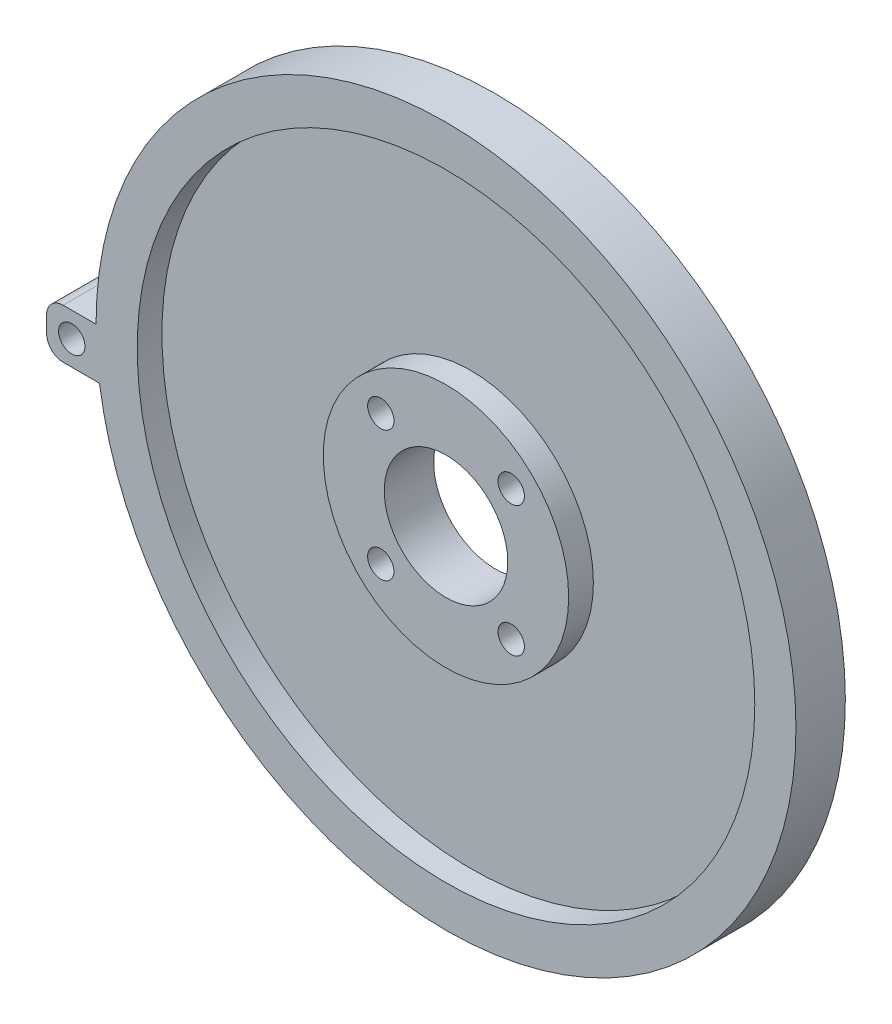
ISO-10303-21;
HEADER;
FILE_DESCRIPTION(('STEP AP214'),'2;1');
FILE_NAME('part.step','',(''),(''),'','','');
FILE_SCHEMA(('AUTOMOTIVE_DESIGN { 1 0 10303 214 1 1 1 1 }'));
ENDSEC;
DATA;
#1=APPLICATION_CONTEXT('core data for automotive mechanical design processes');
#2=APPLICATION_PROTOCOL_DEFINITION('international standard','automotive_design',2000,#1);
#3=PRODUCT_CONTEXT('',#1,'mechanical');
#4=PRODUCT('Part','Part','',(#3));
#5=PRODUCT_RELATED_PRODUCT_CATEGORY('part','',(#4));
#6=PRODUCT_DEFINITION_FORMATION('','',#4);
#7=PRODUCT_DEFINITION_CONTEXT('part definition',#1,'design');
#8=PRODUCT_DEFINITION('design','',#6,#7);
#9=PRODUCT_DEFINITION_SHAPE('','',#8);
#10=(LENGTH_UNIT() NAMED_UNIT(*) SI_UNIT(.MILLI.,.METRE.));
#11=(NAMED_UNIT(*) PLANE_ANGLE_UNIT() SI_UNIT($,.RADIAN.));
#12=(NAMED_UNIT(*) SI_UNIT($,.STERADIAN.) SOLID_ANGLE_UNIT());
#13=UNCERTAINTY_MEASURE_WITH_UNIT(LENGTH_MEASURE(1.E-05),#10,'distance_accuracy_value','');
#14=(GEOMETRIC_REPRESENTATION_CONTEXT(3) GLOBAL_UNCERTAINTY_ASSIGNED_CONTEXT((#13)) GLOBAL_UNIT_ASSIGNED_CONTEXT((#10,
#11,#12)) REPRESENTATION_CONTEXT('',''));
#15=CARTESIAN_POINT('',(0.,0.,0.));
#16=DIRECTION('',(0.,0.,1.));
#17=DIRECTION('',(1.,0.,0.));
#18=AXIS2_PLACEMENT_3D('',#15,#16,#17);
#19=CARTESIAN_POINT('',(260.117045421253,-9.10000000006363,3.));
#20=DIRECTION('',(0.,0.,-1.));
#21=DIRECTION('',(-1.,0.,0.));
#22=AXIS2_PLACEMENT_3D('',#19,#20,#21);
#23=CYLINDRICAL_SURFACE('',#22,42.4999999999999);
#24=DIRECTION('',(0.,0.,-1.));
#25=VECTOR('',#24,1.);
#26=CARTESIAN_POINT('',(217.617045421253,-9.10000000006364,14.7914230722365));
#27=LINE('',#26,#25);
#28=CARTESIAN_POINT('',(217.617045421253,-9.10000000006364,6.));
#29=VERTEX_POINT('',#28);
#30=CARTESIAN_POINT('',(217.617045421253,-9.10000000006364,0.));
#31=VERTEX_POINT('',#30);
#32=EDGE_CURVE('E119',#29,#31,#27,.T.);
#33=ORIENTED_EDGE('',*,*,#32,.F.);
#34=CARTESIAN_POINT('',(260.117045421253,-9.10000000006363,6.));
#35=DIRECTION('',(0.,0.,1.));
#36=DIRECTION('',(1.,0.,0.));
#37=AXIS2_PLACEMENT_3D('',#34,#35,#36);
#38=CIRCLE('',#37,42.4999999999999);
#39=CARTESIAN_POINT('',(218.042706448419,-15.0999999999819,6.));
#40=VERTEX_POINT('',#39);
#41=EDGE_CURVE('E117',#40,#29,#38,.T.);
#42=ORIENTED_EDGE('',*,*,#41,.F.);
#43=DIRECTION('',(0.,0.,-1.));
#44=VECTOR('',#43,1.);
#45=CARTESIAN_POINT('',(218.042706448419,-15.0999999999819,14.7914230722365));
#46=LINE('',#45,#44);
#47=CARTESIAN_POINT('',(218.042706448419,-15.0999999999819,0.));
#48=VERTEX_POINT('',#47);
#49=EDGE_CURVE('E102',#40,#48,#46,.T.);
#50=ORIENTED_EDGE('',*,*,#49,.T.);
#51=CARTESIAN_POINT('',(260.117045421253,-9.10000000006363,0.));
#52=DIRECTION('',(0.,0.,1.));
#53=DIRECTION('',(1.,0.,0.));
#54=AXIS2_PLACEMENT_3D('',#51,#52,#53);
#55=CIRCLE('',#54,42.4999999999999);
#56=EDGE_CURVE('E54',#48,#31,#55,.T.);
#57=ORIENTED_EDGE('',*,*,#56,.T.);
#58=EDGE_LOOP('',(#33,#42,#50,#57));
#59=FACE_BOUND('',#58,.T.);
#60=ADVANCED_FACE('F46',(#59),#23,.T.);
#61=CARTESIAN_POINT('',(260.117045421253,-9.10000000006363,3.));
#62=DIRECTION('',(0.,0.,1.));
#63=DIRECTION('',(1.,0.,0.));
#64=AXIS2_PLACEMENT_3D('',#61,#62,#63);
#65=PLANE('',#64);
#66=CARTESIAN_POINT('',(260.117045421253,-9.10000000006363,3.));
#67=DIRECTION('',(0.,0.,1.));
#68=DIRECTION('',(1.,0.,0.));
#69=AXIS2_PLACEMENT_3D('',#66,#67,#68);
#70=CIRCLE('',#69,14.9);
#71=CARTESIAN_POINT('',(275.017045421253,-9.10000000006363,3.));
#72=VERTEX_POINT('',#71);
#73=EDGE_CURVE('E157',#72,#72,#70,.T.);
#74=ORIENTED_EDGE('',*,*,#73,.F.);
#75=EDGE_LOOP('',(#74));
#76=FACE_BOUND('',#75,.T.);
#77=CARTESIAN_POINT('',(260.117045421253,-9.10000000006363,3.));
#78=DIRECTION('',(0.,0.,1.));
#79=DIRECTION('',(1.,0.,0.));
#80=AXIS2_PLACEMENT_3D('',#77,#78,#79);
#81=CIRCLE('',#80,37.4999999999999);
#82=CARTESIAN_POINT('',(297.617045421253,-9.10000000006363,3.));
#83=VERTEX_POINT('',#82);
#84=EDGE_CURVE('E12',#83,#83,#81,.F.);
#85=ORIENTED_EDGE('',*,*,#84,.F.);
#86=EDGE_LOOP('',(#85));
#87=FACE_BOUND('',#86,.T.);
#88=ADVANCED_FACE('F281',(#76,#87),#65,.T.);
#89=CARTESIAN_POINT('',(260.117045421253,-9.10000000006363,0.));
#90=DIRECTION('',(0.,0.,1.));
#91=DIRECTION('',(1.,0.,0.));
#92=AXIS2_PLACEMENT_3D('',#89,#90,#91);
#93=PLANE('',#92);
#94=ORIENTED_EDGE('',*,*,#56,.F.);
#95=DIRECTION('',(-1.,0.,0.));
#96=VECTOR('',#95,1.);
#97=CARTESIAN_POINT('',(213.617045421253,-15.0999999999819,0.));
#98=LINE('',#97,#96);
#99=CARTESIAN_POINT('',(213.617045421253,-15.0999999999819,0.));
#100=VERTEX_POINT('',#99);
#101=EDGE_CURVE('E99',#48,#100,#98,.T.);
#102=ORIENTED_EDGE('',*,*,#101,.T.);
#103=CARTESIAN_POINT('',(213.617045421253,-13.0999999999819,0.));
#104=DIRECTION('',(0.,0.,1.));
#105=DIRECTION('',(1.,0.,0.));
#106=AXIS2_PLACEMENT_3D('',#103,#104,#105);
#107=CIRCLE('',#106,2.);
#108=CARTESIAN_POINT('',(211.617045421253,-13.0999999999819,0.));
#109=VERTEX_POINT('',#108);
#110=EDGE_CURVE('E112',#100,#109,#107,.F.);
#111=ORIENTED_EDGE('',*,*,#110,.T.);
#112=DIRECTION('',(0.,1.,0.));
#113=VECTOR('',#112,1.);
#114=CARTESIAN_POINT('',(211.617045421253,-11.1000000000636,0.));
#115=LINE('',#114,#113);
#116=CARTESIAN_POINT('',(211.617045421253,-11.1000000000636,0.));
#117=VERTEX_POINT('',#116);
#118=EDGE_CURVE('E222',#109,#117,#115,.T.);
#119=ORIENTED_EDGE('',*,*,#118,.T.);
#120=CARTESIAN_POINT('',(213.617045421253,-11.1000000000636,0.));
#121=DIRECTION('',(0.,0.,1.));
#122=DIRECTION('',(1.,0.,0.));
#123=AXIS2_PLACEMENT_3D('',#120,#121,#122);
#124=CIRCLE('',#123,2.);
#125=CARTESIAN_POINT('',(213.617045421253,-9.10000000006364,0.));
#126=VERTEX_POINT('',#125);
#127=EDGE_CURVE('E226',#117,#126,#124,.F.);
#128=ORIENTED_EDGE('',*,*,#127,.T.);
#129=DIRECTION('',(1.,0.,0.));
#130=VECTOR('',#129,1.);
#131=CARTESIAN_POINT('',(217.617045421253,-9.10000000006364,0.));
#132=LINE('',#131,#130);
#133=EDGE_CURVE('E126',#126,#31,#132,.T.);
#134=ORIENTED_EDGE('',*,*,#133,.T.);
#135=EDGE_LOOP('',(#94,#102,#111,#119,#128,#134));
#136=FACE_BOUND('',#135,.T.);
#137=CARTESIAN_POINT('',(260.117045421253,-9.10000000006363,0.));
#138=DIRECTION('',(0.,0.,1.));
#139=DIRECTION('',(1.,0.,0.));
#140=AXIS2_PLACEMENT_3D('',#137,#138,#139);
#141=CIRCLE('',#140,7.49999999999995);
#142=CARTESIAN_POINT('',(267.617045421253,-9.10000000006363,0.));
#143=VERTEX_POINT('',#142);
#144=EDGE_CURVE('E128',#143,#143,#141,.T.);
#145=ORIENTED_EDGE('',*,*,#144,.T.);
#146=EDGE_LOOP('',(#145));
#147=FACE_BOUND('',#146,.T.);
#148=CARTESIAN_POINT('',(252.19744947196,-1.18040405078631,0.));
#149=DIRECTION('',(0.,0.,1.));
#150=DIRECTION('',(1.,0.,0.));
#151=AXIS2_PLACEMENT_3D('',#148,#149,#150);
#152=CIRCLE('',#151,1.59999999999404);
#153=CARTESIAN_POINT('',(253.797449471954,-1.18040405078631,0.));
#154=VERTEX_POINT('',#153);
#155=EDGE_CURVE('E132',#154,#154,#152,.T.);
#156=ORIENTED_EDGE('',*,*,#155,.T.);
#157=EDGE_LOOP('',(#156));
#158=FACE_BOUND('',#157,.T.);
#159=CARTESIAN_POINT('',(268.03664137053,-1.18040405077101,0.));
#160=DIRECTION('',(0.,0.,1.));
#161=DIRECTION('',(1.,0.,0.));
#162=AXIS2_PLACEMENT_3D('',#159,#160,#161);
#163=CIRCLE('',#162,1.59999999999404);
#164=CARTESIAN_POINT('',(269.636641370524,-1.18040405077101,0.));
#165=VERTEX_POINT('',#164);
#166=EDGE_CURVE('E138',#165,#165,#163,.T.);
#167=ORIENTED_EDGE('',*,*,#166,.T.);
#168=EDGE_LOOP('',(#167));
#169=FACE_BOUND('',#168,.T.);
#170=CARTESIAN_POINT('',(252.197449471976,-17.0195959493562,0.));
#171=DIRECTION('',(0.,0.,1.));
#172=DIRECTION('',(1.,0.,0.));
#173=AXIS2_PLACEMENT_3D('',#170,#171,#172);
#174=CIRCLE('',#173,1.59999999999427);
#175=CARTESIAN_POINT('',(253.79744947197,-17.0195959493562,0.));
#176=VERTEX_POINT('',#175);
#177=EDGE_CURVE('E142',#176,#176,#174,.T.);
#178=ORIENTED_EDGE('',*,*,#177,.T.);
#179=EDGE_LOOP('',(#178));
#180=FACE_BOUND('',#179,.T.);
#181=CARTESIAN_POINT('',(268.036641370546,-17.019595949341,0.));
#182=DIRECTION('',(0.,0.,1.));
#183=DIRECTION('',(1.,0.,0.));
#184=AXIS2_PLACEMENT_3D('',#181,#182,#183);
#185=CIRCLE('',#184,1.59999999999404);
#186=CARTESIAN_POINT('',(269.63664137054,-17.019595949341,0.));
#187=VERTEX_POINT('',#186);
#188=EDGE_CURVE('E146',#187,#187,#185,.T.);
#189=ORIENTED_EDGE('',*,*,#188,.T.);
#190=EDGE_LOOP('',(#189));
#191=FACE_BOUND('',#190,.T.);
#192=CARTESIAN_POINT('',(214.670319829944,-12.1037699979797,0.));
#193=DIRECTION('',(0.,0.,1.));
#194=DIRECTION('',(1.,0.,0.));
#195=AXIS2_PLACEMENT_3D('',#192,#193,#194);
#196=CIRCLE('',#195,1.59999999999999);
#197=CARTESIAN_POINT('',(216.270319829944,-12.1037699979797,0.));
#198=VERTEX_POINT('',#197);
#199=EDGE_CURVE('E111',#198,#198,#196,.F.);
#200=ORIENTED_EDGE('',*,*,#199,.F.);
#201=EDGE_LOOP('',(#200));
#202=FACE_BOUND('',#201,.T.);
#203=ADVANCED_FACE('F122',(#136,#147,#158,#169,#180,#191,#202),#93,.F.);
#204=CARTESIAN_POINT('',(260.117045421253,-9.10000000006363,3.));
#205=DIRECTION('',(0.,0.,-1.));
#206=DIRECTION('',(-1.,0.,0.));
#207=AXIS2_PLACEMENT_3D('',#204,#205,#206);
#208=CYLINDRICAL_SURFACE('',#207,7.49999999999995);
#209=ORIENTED_EDGE('',*,*,#144,.F.);
#210=EDGE_LOOP('',(#209));
#211=FACE_BOUND('',#210,.T.);
#212=CARTESIAN_POINT('',(260.117045421253,-9.10000000006363,6.));
#213=DIRECTION('',(0.,0.,1.));
#214=DIRECTION('',(1.,0.,0.));
#215=AXIS2_PLACEMENT_3D('',#212,#213,#214);
#216=CIRCLE('',#215,7.49999999999995);
#217=CARTESIAN_POINT('',(267.617045421253,-9.10000000006363,6.));
#218=VERTEX_POINT('',#217);
#219=EDGE_CURVE('E169',#218,#218,#216,.F.);
#220=ORIENTED_EDGE('',*,*,#219,.F.);
#221=EDGE_LOOP('',(#220));
#222=FACE_BOUND('',#221,.T.);
#223=ADVANCED_FACE('F290',(#211,#222),#208,.F.);
#224=CARTESIAN_POINT('',(252.19744947196,-1.18040405078631,3.));
#225=DIRECTION('',(0.,0.,-1.));
#226=DIRECTION('',(-1.,0.,0.));
#227=AXIS2_PLACEMENT_3D('',#224,#225,#226);
#228=CYLINDRICAL_SURFACE('',#227,1.59999999999404);
#229=ORIENTED_EDGE('',*,*,#155,.F.);
#230=EDGE_LOOP('',(#229));
#231=FACE_BOUND('',#230,.T.);
#232=CARTESIAN_POINT('',(252.19744947196,-1.18040405078631,6.));
#233=DIRECTION('',(0.,0.,1.));
#234=DIRECTION('',(1.,0.,0.));
#235=AXIS2_PLACEMENT_3D('',#232,#233,#234);
#236=CIRCLE('',#235,1.59999999999404);
#237=CARTESIAN_POINT('',(253.797449471954,-1.18040405078631,6.));
#238=VERTEX_POINT('',#237);
#239=EDGE_CURVE('E165',#238,#238,#236,.F.);
#240=ORIENTED_EDGE('',*,*,#239,.F.);
#241=EDGE_LOOP('',(#240));
#242=FACE_BOUND('',#241,.T.);
#243=ADVANCED_FACE('F296',(#231,#242),#228,.F.);
#244=CARTESIAN_POINT('',(268.03664137053,-1.18040405077101,3.));
#245=DIRECTION('',(0.,0.,-1.));
#246=DIRECTION('',(-1.,0.,0.));
#247=AXIS2_PLACEMENT_3D('',#244,#245,#246);
#248=CYLINDRICAL_SURFACE('',#247,1.59999999999404);
#249=ORIENTED_EDGE('',*,*,#166,.F.);
#250=EDGE_LOOP('',(#249));
#251=FACE_BOUND('',#250,.T.);
#252=CARTESIAN_POINT('',(268.03664137053,-1.18040405077101,6.));
#253=DIRECTION('',(0.,0.,1.));
#254=DIRECTION('',(1.,0.,0.));
#255=AXIS2_PLACEMENT_3D('',#252,#253,#254);
#256=CIRCLE('',#255,1.59999999999404);
#257=CARTESIAN_POINT('',(269.636641370524,-1.18040405077101,6.));
#258=VERTEX_POINT('',#257);
#259=EDGE_CURVE('E177',#258,#258,#256,.F.);
#260=ORIENTED_EDGE('',*,*,#259,.F.);
#261=EDGE_LOOP('',(#260));
#262=FACE_BOUND('',#261,.T.);
#263=ADVANCED_FACE('F300',(#251,#262),#248,.F.);
#264=CARTESIAN_POINT('',(252.197449471976,-17.0195959493562,3.));
#265=DIRECTION('',(0.,0.,-1.));
#266=DIRECTION('',(-1.,0.,0.));
#267=AXIS2_PLACEMENT_3D('',#264,#265,#266);
#268=CYLINDRICAL_SURFACE('',#267,1.59999999999427);
#269=ORIENTED_EDGE('',*,*,#177,.F.);
#270=EDGE_LOOP('',(#269));
#271=FACE_BOUND('',#270,.T.);
#272=CARTESIAN_POINT('',(252.197449471976,-17.0195959493562,6.));
#273=DIRECTION('',(0.,0.,1.));
#274=DIRECTION('',(1.,0.,0.));
#275=AXIS2_PLACEMENT_3D('',#272,#273,#274);
#276=CIRCLE('',#275,1.59999999999427);
#277=CARTESIAN_POINT('',(253.79744947197,-17.0195959493562,6.));
#278=VERTEX_POINT('',#277);
#279=EDGE_CURVE('E161',#278,#278,#276,.F.);
#280=ORIENTED_EDGE('',*,*,#279,.F.);
#281=EDGE_LOOP('',(#280));
#282=FACE_BOUND('',#281,.T.);
#283=ADVANCED_FACE('F304',(#271,#282),#268,.F.);
#284=CARTESIAN_POINT('',(268.036641370546,-17.019595949341,3.));
#285=DIRECTION('',(0.,0.,-1.));
#286=DIRECTION('',(-1.,0.,0.));
#287=AXIS2_PLACEMENT_3D('',#284,#285,#286);
#288=CYLINDRICAL_SURFACE('',#287,1.59999999999404);
#289=ORIENTED_EDGE('',*,*,#188,.F.);
#290=EDGE_LOOP('',(#289));
#291=FACE_BOUND('',#290,.T.);
#292=CARTESIAN_POINT('',(268.036641370546,-17.019595949341,6.));
#293=DIRECTION('',(0.,0.,1.));
#294=DIRECTION('',(1.,0.,0.));
#295=AXIS2_PLACEMENT_3D('',#292,#293,#294);
#296=CIRCLE('',#295,1.59999999999404);
#297=CARTESIAN_POINT('',(269.63664137054,-17.019595949341,6.));
#298=VERTEX_POINT('',#297);
#299=EDGE_CURVE('E173',#298,#298,#296,.F.);
#300=ORIENTED_EDGE('',*,*,#299,.F.);
#301=EDGE_LOOP('',(#300));
#302=FACE_BOUND('',#301,.T.);
#303=ADVANCED_FACE('F308',(#291,#302),#288,.F.);
#304=CARTESIAN_POINT('',(260.117045421253,-9.10000000006363,6.));
#305=DIRECTION('',(0.,0.,-1.));
#306=DIRECTION('',(-1.,0.,0.));
#307=AXIS2_PLACEMENT_3D('',#304,#305,#306);
#308=CYLINDRICAL_SURFACE('',#307,37.4999999999999);
#309=CARTESIAN_POINT('',(260.117045421253,-9.10000000006363,6.));
#310=DIRECTION('',(0.,0.,1.));
#311=DIRECTION('',(1.,0.,0.));
#312=AXIS2_PLACEMENT_3D('',#309,#310,#311);
#313=CIRCLE('',#312,37.4999999999999);
#314=CARTESIAN_POINT('',(297.617045421253,-9.10000000006363,6.));
#315=VERTEX_POINT('',#314);
#316=EDGE_CURVE('E152',#315,#315,#313,.T.);
#317=ORIENTED_EDGE('',*,*,#316,.T.);
#318=EDGE_LOOP('',(#317));
#319=FACE_BOUND('',#318,.T.);
#320=ORIENTED_EDGE('',*,*,#84,.T.);
#321=EDGE_LOOP('',(#320));
#322=FACE_BOUND('',#321,.T.);
#323=ADVANCED_FACE('F312',(#319,#322),#308,.F.);
#324=CARTESIAN_POINT('',(0.,0.,6.));
#325=DIRECTION('',(0.,0.,1.));
#326=DIRECTION('',(1.,0.,0.));
#327=AXIS2_PLACEMENT_3D('',#324,#325,#326);
#328=PLANE('',#327);
#329=ORIENTED_EDGE('',*,*,#316,.F.);
#330=EDGE_LOOP('',(#329));
#331=FACE_BOUND('',#330,.T.);
#332=ORIENTED_EDGE('',*,*,#41,.T.);
#333=DIRECTION('',(-1.,0.,0.));
#334=VECTOR('',#333,1.);
#335=CARTESIAN_POINT('',(217.617045421253,-9.10000000006364,6.));
#336=LINE('',#335,#334);
#337=CARTESIAN_POINT('',(213.617045421253,-9.10000000006364,6.));
#338=VERTEX_POINT('',#337);
#339=EDGE_CURVE('E206',#29,#338,#336,.T.);
#340=ORIENTED_EDGE('',*,*,#339,.T.);
#341=CARTESIAN_POINT('',(213.617045421253,-11.1000000000636,6.));
#342=DIRECTION('',(0.,0.,1.));
#343=DIRECTION('',(1.,0.,0.));
#344=AXIS2_PLACEMENT_3D('',#341,#342,#343);
#345=CIRCLE('',#344,2.);
#346=CARTESIAN_POINT('',(211.617045421253,-11.1000000000636,6.));
#347=VERTEX_POINT('',#346);
#348=EDGE_CURVE('E210',#338,#347,#345,.T.);
#349=ORIENTED_EDGE('',*,*,#348,.T.);
#350=DIRECTION('',(0.,-1.,0.));
#351=VECTOR('',#350,1.);
#352=CARTESIAN_POINT('',(211.617045421253,-11.1000000000636,6.));
#353=LINE('',#352,#351);
#354=CARTESIAN_POINT('',(211.617045421253,-13.0999999999819,6.));
#355=VERTEX_POINT('',#354);
#356=EDGE_CURVE('E188',#347,#355,#353,.T.);
#357=ORIENTED_EDGE('',*,*,#356,.T.);
#358=CARTESIAN_POINT('',(213.617045421253,-13.0999999999819,6.));
#359=DIRECTION('',(0.,0.,1.));
#360=DIRECTION('',(1.,0.,0.));
#361=AXIS2_PLACEMENT_3D('',#358,#359,#360);
#362=CIRCLE('',#361,2.);
#363=CARTESIAN_POINT('',(213.617045421253,-15.0999999999819,6.));
#364=VERTEX_POINT('',#363);
#365=EDGE_CURVE('E201',#355,#364,#362,.T.);
#366=ORIENTED_EDGE('',*,*,#365,.T.);
#367=DIRECTION('',(1.,0.,0.));
#368=VECTOR('',#367,1.);
#369=CARTESIAN_POINT('',(213.617045421253,-15.0999999999819,6.));
#370=LINE('',#369,#368);
#371=EDGE_CURVE('E61',#364,#40,#370,.T.);
#372=ORIENTED_EDGE('',*,*,#371,.T.);
#373=EDGE_LOOP('',(#332,#340,#349,#357,#366,#372));
#374=FACE_BOUND('',#373,.T.);
#375=CARTESIAN_POINT('',(214.670319829944,-12.1037699979797,6.));
#376=DIRECTION('',(0.,0.,1.));
#377=DIRECTION('',(1.,0.,0.));
#378=AXIS2_PLACEMENT_3D('',#375,#376,#377);
#379=CIRCLE('',#378,1.59999999999999);
#380=CARTESIAN_POINT('',(216.270319829944,-12.1037699979797,6.));
#381=VERTEX_POINT('',#380);
#382=EDGE_CURVE('E184',#381,#381,#379,.T.);
#383=ORIENTED_EDGE('',*,*,#382,.F.);
#384=EDGE_LOOP('',(#383));
#385=FACE_BOUND('',#384,.T.);
#386=ADVANCED_FACE('F266',(#331,#374,#385),#328,.T.);
#387=CARTESIAN_POINT('',(260.117045421253,-9.10000000006363,6.));
#388=DIRECTION('',(0.,0.,-1.));
#389=DIRECTION('',(-1.,0.,0.));
#390=AXIS2_PLACEMENT_3D('',#387,#388,#389);
#391=CYLINDRICAL_SURFACE('',#390,14.9);
#392=CARTESIAN_POINT('',(260.117045421253,-9.10000000006363,6.));
#393=DIRECTION('',(0.,0.,1.));
#394=DIRECTION('',(1.,0.,0.));
#395=AXIS2_PLACEMENT_3D('',#392,#393,#394);
#396=CIRCLE('',#395,14.9);
#397=CARTESIAN_POINT('',(275.017045421253,-9.10000000006363,6.));
#398=VERTEX_POINT('',#397);
#399=EDGE_CURVE('E156',#398,#398,#396,.T.);
#400=ORIENTED_EDGE('',*,*,#399,.F.);
#401=EDGE_LOOP('',(#400));
#402=FACE_BOUND('',#401,.T.);
#403=ORIENTED_EDGE('',*,*,#73,.T.);
#404=EDGE_LOOP('',(#403));
#405=FACE_BOUND('',#404,.T.);
#406=ADVANCED_FACE('F319',(#402,#405),#391,.T.);
#407=CARTESIAN_POINT('',(0.,0.,6.));
#408=DIRECTION('',(0.,0.,1.));
#409=DIRECTION('',(1.,0.,0.));
#410=AXIS2_PLACEMENT_3D('',#407,#408,#409);
#411=PLANE('',#410);
#412=ORIENTED_EDGE('',*,*,#279,.T.);
#413=EDGE_LOOP('',(#412));
#414=FACE_BOUND('',#413,.T.);
#415=ORIENTED_EDGE('',*,*,#259,.T.);
#416=EDGE_LOOP('',(#415));
#417=FACE_BOUND('',#416,.T.);
#418=ORIENTED_EDGE('',*,*,#299,.T.);
#419=EDGE_LOOP('',(#418));
#420=FACE_BOUND('',#419,.T.);
#421=ORIENTED_EDGE('',*,*,#219,.T.);
#422=EDGE_LOOP('',(#421));
#423=FACE_BOUND('',#422,.T.);
#424=ORIENTED_EDGE('',*,*,#239,.T.);
#425=EDGE_LOOP('',(#424));
#426=FACE_BOUND('',#425,.T.);
#427=ORIENTED_EDGE('',*,*,#399,.T.);
#428=EDGE_LOOP('',(#427));
#429=FACE_BOUND('',#428,.T.);
#430=ADVANCED_FACE('F277',(#414,#417,#420,#423,#426,#429),#411,.T.);
#431=CARTESIAN_POINT('',(211.617045421253,-11.1000000000636,14.7914230722365));
#432=DIRECTION('',(1.,0.,0.));
#433=DIRECTION('',(0.,0.,-1.));
#434=AXIS2_PLACEMENT_3D('',#431,#432,#433);
#435=PLANE('',#434);
#436=ORIENTED_EDGE('',*,*,#356,.F.);
#437=DIRECTION('',(0.,0.,-1.));
#438=VECTOR('',#437,1.);
#439=CARTESIAN_POINT('',(211.617045421253,-11.1000000000636,14.7914230722365));
#440=LINE('',#439,#438);
#441=EDGE_CURVE('E69',#347,#117,#440,.T.);
#442=ORIENTED_EDGE('',*,*,#441,.T.);
#443=ORIENTED_EDGE('',*,*,#118,.F.);
#444=DIRECTION('',(0.,0.,-1.));
#445=VECTOR('',#444,1.);
#446=CARTESIAN_POINT('',(211.617045421253,-13.0999999999819,14.7914230722365));
#447=LINE('',#446,#445);
#448=EDGE_CURVE('E198',#355,#109,#447,.T.);
#449=ORIENTED_EDGE('',*,*,#448,.F.);
#450=EDGE_LOOP('',(#436,#442,#443,#449));
#451=FACE_BOUND('',#450,.T.);
#452=ADVANCED_FACE('F270',(#451),#435,.F.);
#453=CARTESIAN_POINT('',(213.617045421253,-11.1000000000636,14.7914230722365));
#454=DIRECTION('',(0.,0.,-1.));
#455=DIRECTION('',(-1.,0.,0.));
#456=AXIS2_PLACEMENT_3D('',#453,#454,#455);
#457=CYLINDRICAL_SURFACE('',#456,2.);
#458=ORIENTED_EDGE('',*,*,#348,.F.);
#459=DIRECTION('',(0.,0.,-1.));
#460=VECTOR('',#459,1.);
#461=CARTESIAN_POINT('',(213.617045421253,-9.10000000006364,14.7914230722365));
#462=LINE('',#461,#460);
#463=EDGE_CURVE('E193',#338,#126,#462,.T.);
#464=ORIENTED_EDGE('',*,*,#463,.T.);
#465=ORIENTED_EDGE('',*,*,#127,.F.);
#466=ORIENTED_EDGE('',*,*,#441,.F.);
#467=EDGE_LOOP('',(#458,#464,#465,#466));
#468=FACE_BOUND('',#467,.T.);
#469=ADVANCED_FACE('F268',(#468),#457,.T.);
#470=CARTESIAN_POINT('',(217.617045421253,-9.10000000006364,14.7914230722365));
#471=DIRECTION('',(0.,-1.,0.));
#472=DIRECTION('',(0.,0.,-1.));
#473=AXIS2_PLACEMENT_3D('',#470,#471,#472);
#474=PLANE('',#473);
#475=ORIENTED_EDGE('',*,*,#339,.F.);
#476=ORIENTED_EDGE('',*,*,#32,.T.);
#477=ORIENTED_EDGE('',*,*,#133,.F.);
#478=ORIENTED_EDGE('',*,*,#463,.F.);
#479=EDGE_LOOP('',(#475,#476,#477,#478));
#480=FACE_BOUND('',#479,.T.);
#481=ADVANCED_FACE('F265',(#480),#474,.F.);
#482=CARTESIAN_POINT('',(213.617045421253,-15.0999999999819,14.7914230722365));
#483=DIRECTION('',(0.,1.,0.));
#484=DIRECTION('',(0.,0.,1.));
#485=AXIS2_PLACEMENT_3D('',#482,#483,#484);
#486=PLANE('',#485);
#487=ORIENTED_EDGE('',*,*,#371,.F.);
#488=DIRECTION('',(0.,0.,-1.));
#489=VECTOR('',#488,1.);
#490=CARTESIAN_POINT('',(213.617045421253,-15.0999999999819,14.7914230722365));
#491=LINE('',#490,#489);
#492=EDGE_CURVE('E105',#364,#100,#491,.T.);
#493=ORIENTED_EDGE('',*,*,#492,.T.);
#494=ORIENTED_EDGE('',*,*,#101,.F.);
#495=ORIENTED_EDGE('',*,*,#49,.F.);
#496=EDGE_LOOP('',(#487,#493,#494,#495));
#497=FACE_BOUND('',#496,.T.);
#498=ADVANCED_FACE('F101',(#497),#486,.F.);
#499=CARTESIAN_POINT('',(213.617045421253,-13.0999999999819,14.7914230722365));
#500=DIRECTION('',(0.,0.,-1.));
#501=DIRECTION('',(-1.,0.,0.));
#502=AXIS2_PLACEMENT_3D('',#499,#500,#501);
#503=CYLINDRICAL_SURFACE('',#502,2.);
#504=ORIENTED_EDGE('',*,*,#365,.F.);
#505=ORIENTED_EDGE('',*,*,#448,.T.);
#506=ORIENTED_EDGE('',*,*,#110,.F.);
#507=ORIENTED_EDGE('',*,*,#492,.F.);
#508=EDGE_LOOP('',(#504,#505,#506,#507));
#509=FACE_BOUND('',#508,.T.);
#510=ADVANCED_FACE('F327',(#509),#503,.T.);
#511=CARTESIAN_POINT('',(214.670319829944,-12.1037699979797,14.7914230722365));
#512=DIRECTION('',(0.,0.,-1.));
#513=DIRECTION('',(-1.,0.,0.));
#514=AXIS2_PLACEMENT_3D('',#511,#512,#513);
#515=CYLINDRICAL_SURFACE('',#514,1.59999999999999);
#516=ORIENTED_EDGE('',*,*,#382,.T.);
#517=EDGE_LOOP('',(#516));
#518=FACE_BOUND('',#517,.T.);
#519=ORIENTED_EDGE('',*,*,#199,.T.);
#520=EDGE_LOOP('',(#519));
#521=FACE_BOUND('',#520,.T.);
#522=ADVANCED_FACE('F330',(#518,#521),#515,.F.);
#523=CLOSED_SHELL('',(#60,#88,#203,#223,#243,#263,#283,#303,#323,#386,#406,#430,#452,#469,#481,
#498,#510,#522));
#524=MANIFOLD_SOLID_BREP('B2',#523);
#525=ADVANCED_BREP_SHAPE_REPRESENTATION('',(#18,#524),#14);
#526=SHAPE_DEFINITION_REPRESENTATION(#9,#525);
ENDSEC;
END-ISO-10303-21;
